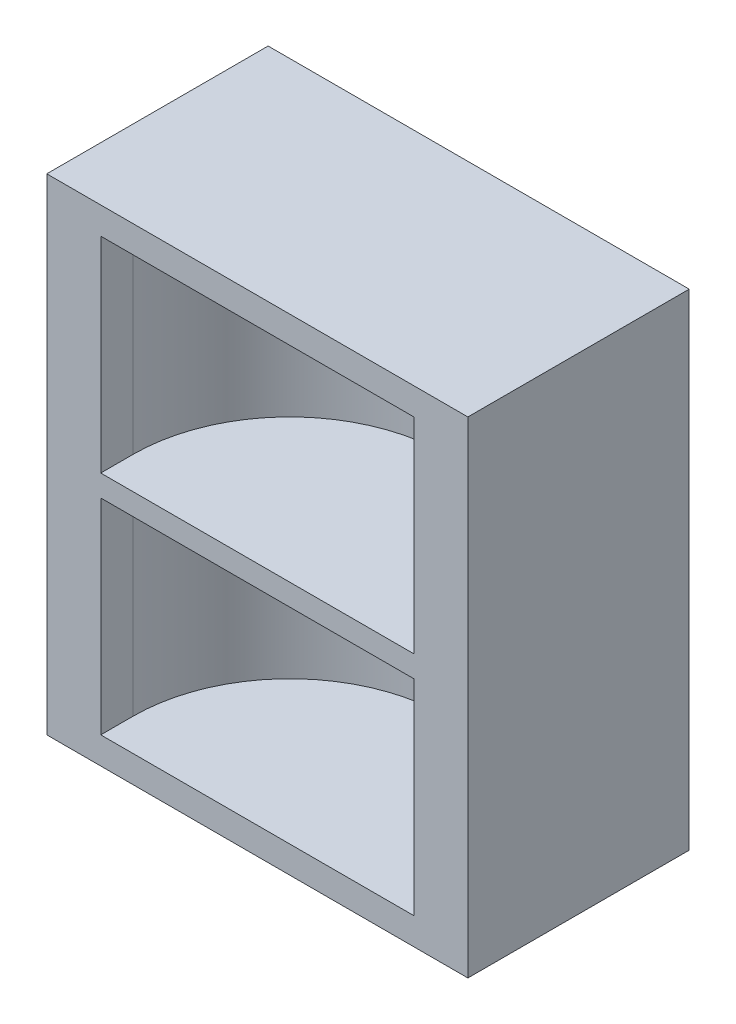
ISO-10303-21;
HEADER;
FILE_DESCRIPTION(('STEP AP214'),'2;1');
FILE_NAME('part.step','',(''),(''),'','','');
FILE_SCHEMA(('AUTOMOTIVE_DESIGN { 1 0 10303 214 1 1 1 1 }'));
ENDSEC;
DATA;
#1=APPLICATION_CONTEXT('core data for automotive mechanical design processes');
#2=APPLICATION_PROTOCOL_DEFINITION('international standard','automotive_design',2000,#1);
#3=PRODUCT_CONTEXT('',#1,'mechanical');
#4=PRODUCT('Part','Part','',(#3));
#5=PRODUCT_RELATED_PRODUCT_CATEGORY('part','',(#4));
#6=PRODUCT_DEFINITION_FORMATION('','',#4);
#7=PRODUCT_DEFINITION_CONTEXT('part definition',#1,'design');
#8=PRODUCT_DEFINITION('design','',#6,#7);
#9=PRODUCT_DEFINITION_SHAPE('','',#8);
#10=(LENGTH_UNIT() NAMED_UNIT(*) SI_UNIT(.MILLI.,.METRE.));
#11=(NAMED_UNIT(*) PLANE_ANGLE_UNIT() SI_UNIT($,.RADIAN.));
#12=(NAMED_UNIT(*) SI_UNIT($,.STERADIAN.) SOLID_ANGLE_UNIT());
#13=UNCERTAINTY_MEASURE_WITH_UNIT(LENGTH_MEASURE(1.E-05),#10,'distance_accuracy_value','');
#14=(GEOMETRIC_REPRESENTATION_CONTEXT(3) GLOBAL_UNCERTAINTY_ASSIGNED_CONTEXT((#13)) GLOBAL_UNIT_ASSIGNED_CONTEXT((#10,
#11,#12)) REPRESENTATION_CONTEXT('',''));
#15=CARTESIAN_POINT('',(0.,0.,0.));
#16=DIRECTION('',(0.,0.,1.));
#17=DIRECTION('',(1.,0.,0.));
#18=AXIS2_PLACEMENT_3D('',#15,#16,#17);
#19=CARTESIAN_POINT('',(39.,45.,0.));
#20=DIRECTION('',(-1.,0.,0.));
#21=DIRECTION('',(0.,0.,1.));
#22=AXIS2_PLACEMENT_3D('',#19,#20,#21);
#23=PLANE('',#22);
#24=DIRECTION('',(0.,0.,-1.));
#25=VECTOR('',#24,1.);
#26=CARTESIAN_POINT('',(39.,-45.,0.));
#27=LINE('',#26,#25);
#28=CARTESIAN_POINT('',(39.,-45.,6.));
#29=VERTEX_POINT('',#28);
#30=CARTESIAN_POINT('',(39.0000000000001,-45.,-35.));
#31=VERTEX_POINT('',#30);
#32=EDGE_CURVE('E66',#29,#31,#27,.T.);
#33=ORIENTED_EDGE('',*,*,#32,.T.);
#34=DIRECTION('',(0.,-1.,0.));
#35=VECTOR('',#34,1.);
#36=CARTESIAN_POINT('',(39.0000000000001,45.,-35.));
#37=LINE('',#36,#35);
#38=CARTESIAN_POINT('',(39.0000000000001,45.,-35.));
#39=VERTEX_POINT('',#38);
#40=EDGE_CURVE('E219',#39,#31,#37,.T.);
#41=ORIENTED_EDGE('',*,*,#40,.F.);
#42=DIRECTION('',(0.,0.,-1.));
#43=VECTOR('',#42,1.);
#44=CARTESIAN_POINT('',(39.,45.,0.));
#45=LINE('',#44,#43);
#46=CARTESIAN_POINT('',(39.,45.,6.));
#47=VERTEX_POINT('',#46);
#48=EDGE_CURVE('E206',#47,#39,#45,.T.);
#49=ORIENTED_EDGE('',*,*,#48,.F.);
#50=DIRECTION('',(0.,1.,0.));
#51=VECTOR('',#50,1.);
#52=CARTESIAN_POINT('',(39.,-45.,6.));
#53=LINE('',#52,#51);
#54=EDGE_CURVE('E192',#29,#47,#53,.T.);
#55=ORIENTED_EDGE('',*,*,#54,.F.);
#56=EDGE_LOOP('',(#33,#41,#49,#55));
#57=FACE_BOUND('',#56,.T.);
#58=ADVANCED_FACE('F39',(#57),#23,.F.);
#59=CARTESIAN_POINT('',(39.0000000000001,45.,-35.));
#60=DIRECTION('',(0.,0.,1.));
#61=DIRECTION('',(1.,0.,0.));
#62=AXIS2_PLACEMENT_3D('',#59,#60,#61);
#63=PLANE('',#62);
#64=DIRECTION('',(-1.,0.,0.));
#65=VECTOR('',#64,1.);
#66=CARTESIAN_POINT('',(39.0000000000001,-45.,-35.));
#67=LINE('',#66,#65);
#68=CARTESIAN_POINT('',(-39.0000000000001,-45.,-35.));
#69=VERTEX_POINT('',#68);
#70=EDGE_CURVE('E214',#31,#69,#67,.T.);
#71=ORIENTED_EDGE('',*,*,#70,.T.);
#72=DIRECTION('',(0.,-1.,0.));
#73=VECTOR('',#72,1.);
#74=CARTESIAN_POINT('',(-39.0000000000001,45.,-35.));
#75=LINE('',#74,#73);
#76=CARTESIAN_POINT('',(-39.0000000000001,45.,-35.));
#77=VERTEX_POINT('',#76);
#78=EDGE_CURVE('E212',#77,#69,#75,.T.);
#79=ORIENTED_EDGE('',*,*,#78,.F.);
#80=DIRECTION('',(-1.,0.,0.));
#81=VECTOR('',#80,1.);
#82=CARTESIAN_POINT('',(39.0000000000001,45.,-35.));
#83=LINE('',#82,#81);
#84=EDGE_CURVE('E55',#39,#77,#83,.T.);
#85=ORIENTED_EDGE('',*,*,#84,.F.);
#86=ORIENTED_EDGE('',*,*,#40,.T.);
#87=EDGE_LOOP('',(#71,#79,#85,#86));
#88=FACE_BOUND('',#87,.T.);
#89=ADVANCED_FACE('F241',(#88),#63,.F.);
#90=CARTESIAN_POINT('',(-39.,45.,0.));
#91=DIRECTION('',(1.,0.,0.));
#92=DIRECTION('',(0.,0.,-1.));
#93=AXIS2_PLACEMENT_3D('',#90,#91,#92);
#94=PLANE('',#93);
#95=DIRECTION('',(0.,0.,1.));
#96=VECTOR('',#95,1.);
#97=CARTESIAN_POINT('',(-39.,-45.,0.));
#98=LINE('',#97,#96);
#99=CARTESIAN_POINT('',(-39.,-45.,6.));
#100=VERTEX_POINT('',#99);
#101=EDGE_CURVE('E208',#69,#100,#98,.T.);
#102=ORIENTED_EDGE('',*,*,#101,.T.);
#103=DIRECTION('',(0.,-1.,0.));
#104=VECTOR('',#103,1.);
#105=CARTESIAN_POINT('',(-39.,45.,6.));
#106=LINE('',#105,#104);
#107=CARTESIAN_POINT('',(-39.,45.,6.));
#108=VERTEX_POINT('',#107);
#109=EDGE_CURVE('E186',#108,#100,#106,.T.);
#110=ORIENTED_EDGE('',*,*,#109,.F.);
#111=DIRECTION('',(0.,0.,1.));
#112=VECTOR('',#111,1.);
#113=CARTESIAN_POINT('',(-39.,45.,0.));
#114=LINE('',#113,#112);
#115=EDGE_CURVE('E210',#77,#108,#114,.T.);
#116=ORIENTED_EDGE('',*,*,#115,.F.);
#117=ORIENTED_EDGE('',*,*,#78,.T.);
#118=EDGE_LOOP('',(#102,#110,#116,#117));
#119=FACE_BOUND('',#118,.T.);
#120=ADVANCED_FACE('F246',(#119),#94,.F.);
#121=CARTESIAN_POINT('',(0.,45.,0.));
#122=DIRECTION('',(0.,-1.,0.));
#123=DIRECTION('',(0.,0.,-1.));
#124=AXIS2_PLACEMENT_3D('',#121,#122,#123);
#125=PLANE('',#124);
#126=ORIENTED_EDGE('',*,*,#115,.T.);
#127=DIRECTION('',(-1.,0.,0.));
#128=VECTOR('',#127,1.);
#129=CARTESIAN_POINT('',(39.,45.,6.));
#130=LINE('',#129,#128);
#131=EDGE_CURVE('E195',#47,#108,#130,.T.);
#132=ORIENTED_EDGE('',*,*,#131,.F.);
#133=ORIENTED_EDGE('',*,*,#48,.T.);
#134=ORIENTED_EDGE('',*,*,#84,.T.);
#135=EDGE_LOOP('',(#126,#132,#133,#134));
#136=FACE_BOUND('',#135,.T.);
#137=ADVANCED_FACE('F250',(#136),#125,.F.);
#138=CARTESIAN_POINT('',(0.,-45.,0.));
#139=DIRECTION('',(0.,-1.,0.));
#140=DIRECTION('',(0.,0.,-1.));
#141=AXIS2_PLACEMENT_3D('',#138,#139,#140);
#142=PLANE('',#141);
#143=ORIENTED_EDGE('',*,*,#32,.F.);
#144=DIRECTION('',(1.,0.,0.));
#145=VECTOR('',#144,1.);
#146=CARTESIAN_POINT('',(-39.,-45.,6.));
#147=LINE('',#146,#145);
#148=EDGE_CURVE('E189',#100,#29,#147,.T.);
#149=ORIENTED_EDGE('',*,*,#148,.F.);
#150=ORIENTED_EDGE('',*,*,#101,.F.);
#151=ORIENTED_EDGE('',*,*,#70,.F.);
#152=EDGE_LOOP('',(#143,#149,#150,#151));
#153=FACE_BOUND('',#152,.T.);
#154=ADVANCED_FACE('F254',(#153),#142,.T.);
#155=CARTESIAN_POINT('',(0.,0.,6.));
#156=DIRECTION('',(0.,0.,1.));
#157=DIRECTION('',(1.,0.,0.));
#158=AXIS2_PLACEMENT_3D('',#155,#156,#157);
#159=PLANE('',#158);
#160=ORIENTED_EDGE('',*,*,#109,.T.);
#161=ORIENTED_EDGE('',*,*,#148,.T.);
#162=ORIENTED_EDGE('',*,*,#54,.T.);
#163=ORIENTED_EDGE('',*,*,#131,.T.);
#164=EDGE_LOOP('',(#160,#161,#162,#163));
#165=FACE_BOUND('',#164,.T.);
#166=DIRECTION('',(0.,1.,0.));
#167=VECTOR('',#166,1.);
#168=CARTESIAN_POINT('',(29.,-1.99999999999997,6.));
#169=LINE('',#168,#167);
#170=CARTESIAN_POINT('',(29.,-40.,6.));
#171=VERTEX_POINT('',#170);
#172=CARTESIAN_POINT('',(29.,-1.99999999999997,6.));
#173=VERTEX_POINT('',#172);
#174=EDGE_CURVE('E167',#171,#173,#169,.T.);
#175=ORIENTED_EDGE('',*,*,#174,.F.);
#176=DIRECTION('',(1.,0.,0.));
#177=VECTOR('',#176,1.);
#178=CARTESIAN_POINT('',(29.,-40.,6.));
#179=LINE('',#178,#177);
#180=CARTESIAN_POINT('',(-29.,-40.,6.));
#181=VERTEX_POINT('',#180);
#182=EDGE_CURVE('E149',#181,#171,#179,.T.);
#183=ORIENTED_EDGE('',*,*,#182,.F.);
#184=DIRECTION('',(0.,-1.,0.));
#185=VECTOR('',#184,1.);
#186=CARTESIAN_POINT('',(-29.,-40.,6.));
#187=LINE('',#186,#185);
#188=CARTESIAN_POINT('',(-29.,-1.99999999999997,6.));
#189=VERTEX_POINT('',#188);
#190=EDGE_CURVE('E172',#189,#181,#187,.T.);
#191=ORIENTED_EDGE('',*,*,#190,.F.);
#192=DIRECTION('',(-1.,0.,0.));
#193=VECTOR('',#192,1.);
#194=CARTESIAN_POINT('',(-29.,-1.99999999999997,6.));
#195=LINE('',#194,#193);
#196=EDGE_CURVE('E169',#173,#189,#195,.T.);
#197=ORIENTED_EDGE('',*,*,#196,.F.);
#198=EDGE_LOOP('',(#175,#183,#191,#197));
#199=FACE_BOUND('',#198,.T.);
#200=DIRECTION('',(-1.,0.,0.));
#201=VECTOR('',#200,1.);
#202=CARTESIAN_POINT('',(-29.,40.,6.));
#203=LINE('',#202,#201);
#204=CARTESIAN_POINT('',(29.,40.,6.));
#205=VERTEX_POINT('',#204);
#206=CARTESIAN_POINT('',(-29.,40.,6.));
#207=VERTEX_POINT('',#206);
#208=EDGE_CURVE('E141',#205,#207,#203,.T.);
#209=ORIENTED_EDGE('',*,*,#208,.F.);
#210=DIRECTION('',(0.,1.,0.));
#211=VECTOR('',#210,1.);
#212=CARTESIAN_POINT('',(29.,40.,6.));
#213=LINE('',#212,#211);
#214=CARTESIAN_POINT('',(29.,1.99999999999999,6.));
#215=VERTEX_POINT('',#214);
#216=EDGE_CURVE('E131',#215,#205,#213,.T.);
#217=ORIENTED_EDGE('',*,*,#216,.F.);
#218=DIRECTION('',(1.,0.,0.));
#219=VECTOR('',#218,1.);
#220=CARTESIAN_POINT('',(29.,1.99999999999999,6.));
#221=LINE('',#220,#219);
#222=CARTESIAN_POINT('',(-29.,1.99999999999999,6.));
#223=VERTEX_POINT('',#222);
#224=EDGE_CURVE('E157',#223,#215,#221,.T.);
#225=ORIENTED_EDGE('',*,*,#224,.F.);
#226=DIRECTION('',(0.,-1.,0.));
#227=VECTOR('',#226,1.);
#228=CARTESIAN_POINT('',(-29.,1.99999999999999,6.));
#229=LINE('',#228,#227);
#230=EDGE_CURVE('E155',#207,#223,#229,.T.);
#231=ORIENTED_EDGE('',*,*,#230,.F.);
#232=EDGE_LOOP('',(#209,#217,#225,#231));
#233=FACE_BOUND('',#232,.T.);
#234=ADVANCED_FACE('F153',(#165,#199,#233),#159,.T.);
#235=CARTESIAN_POINT('',(29.,-1.99999999999997,6.));
#236=DIRECTION('',(-1.,0.,0.));
#237=DIRECTION('',(0.,0.,1.));
#238=AXIS2_PLACEMENT_3D('',#235,#236,#237);
#239=PLANE('',#238);
#240=DIRECTION('',(0.,1.,0.));
#241=VECTOR('',#240,1.);
#242=CARTESIAN_POINT('',(29.,45.,0.));
#243=LINE('',#242,#241);
#244=CARTESIAN_POINT('',(29.,-1.99999999999997,0.));
#245=VERTEX_POINT('',#244);
#246=CARTESIAN_POINT('',(29.,-40.,0.));
#247=VERTEX_POINT('',#246);
#248=EDGE_CURVE('E221',#245,#247,#243,.F.);
#249=ORIENTED_EDGE('',*,*,#248,.T.);
#250=DIRECTION('',(0.,0.,-1.));
#251=VECTOR('',#250,1.);
#252=CARTESIAN_POINT('',(29.,-40.,6.));
#253=LINE('',#252,#251);
#254=EDGE_CURVE('E183',#171,#247,#253,.T.);
#255=ORIENTED_EDGE('',*,*,#254,.F.);
#256=ORIENTED_EDGE('',*,*,#174,.T.);
#257=DIRECTION('',(0.,0.,-1.));
#258=VECTOR('',#257,1.);
#259=CARTESIAN_POINT('',(29.,-1.99999999999997,6.));
#260=LINE('',#259,#258);
#261=EDGE_CURVE('E180',#173,#245,#260,.T.);
#262=ORIENTED_EDGE('',*,*,#261,.T.);
#263=EDGE_LOOP('',(#249,#255,#256,#262));
#264=FACE_BOUND('',#263,.T.);
#265=ADVANCED_FACE('F278',(#264),#239,.T.);
#266=CARTESIAN_POINT('',(-29.,-40.,6.));
#267=DIRECTION('',(1.,0.,0.));
#268=DIRECTION('',(0.,1.,0.));
#269=AXIS2_PLACEMENT_3D('',#266,#267,#268);
#270=PLANE('',#269);
#271=DIRECTION('',(0.,1.,0.));
#272=VECTOR('',#271,1.);
#273=CARTESIAN_POINT('',(-29.,45.,0.));
#274=LINE('',#273,#272);
#275=CARTESIAN_POINT('',(-29.,-40.,0.));
#276=VERTEX_POINT('',#275);
#277=CARTESIAN_POINT('',(-29.,-1.99999999999997,0.));
#278=VERTEX_POINT('',#277);
#279=EDGE_CURVE('E224',#276,#278,#274,.T.);
#280=ORIENTED_EDGE('',*,*,#279,.T.);
#281=DIRECTION('',(0.,0.,-1.));
#282=VECTOR('',#281,1.);
#283=CARTESIAN_POINT('',(-29.,-1.99999999999997,6.));
#284=LINE('',#283,#282);
#285=EDGE_CURVE('E177',#189,#278,#284,.T.);
#286=ORIENTED_EDGE('',*,*,#285,.F.);
#287=ORIENTED_EDGE('',*,*,#190,.T.);
#288=DIRECTION('',(0.,0.,-1.));
#289=VECTOR('',#288,1.);
#290=CARTESIAN_POINT('',(-29.,-40.,6.));
#291=LINE('',#290,#289);
#292=EDGE_CURVE('E174',#181,#276,#291,.T.);
#293=ORIENTED_EDGE('',*,*,#292,.T.);
#294=EDGE_LOOP('',(#280,#286,#287,#293));
#295=FACE_BOUND('',#294,.T.);
#296=ADVANCED_FACE('F238',(#295),#270,.T.);
#297=CARTESIAN_POINT('',(29.,40.,6.));
#298=DIRECTION('',(-1.,0.,0.));
#299=DIRECTION('',(0.,-1.,0.));
#300=AXIS2_PLACEMENT_3D('',#297,#298,#299);
#301=PLANE('',#300);
#302=DIRECTION('',(0.,1.,0.));
#303=VECTOR('',#302,1.);
#304=CARTESIAN_POINT('',(29.,45.,0.));
#305=LINE('',#304,#303);
#306=CARTESIAN_POINT('',(29.,40.,0.));
#307=VERTEX_POINT('',#306);
#308=CARTESIAN_POINT('',(29.,1.99999999999999,0.));
#309=VERTEX_POINT('',#308);
#310=EDGE_CURVE('E47',#307,#309,#305,.F.);
#311=ORIENTED_EDGE('',*,*,#310,.T.);
#312=DIRECTION('',(0.,0.,-1.));
#313=VECTOR('',#312,1.);
#314=CARTESIAN_POINT('',(29.,1.99999999999999,6.));
#315=LINE('',#314,#313);
#316=EDGE_CURVE('E137',#215,#309,#315,.T.);
#317=ORIENTED_EDGE('',*,*,#316,.F.);
#318=ORIENTED_EDGE('',*,*,#216,.T.);
#319=DIRECTION('',(0.,0.,-1.));
#320=VECTOR('',#319,1.);
#321=CARTESIAN_POINT('',(29.,40.,6.));
#322=LINE('',#321,#320);
#323=EDGE_CURVE('E135',#205,#307,#322,.T.);
#324=ORIENTED_EDGE('',*,*,#323,.T.);
#325=EDGE_LOOP('',(#311,#317,#318,#324));
#326=FACE_BOUND('',#325,.T.);
#327=ADVANCED_FACE('F134',(#326),#301,.T.);
#328=CARTESIAN_POINT('',(-29.,1.99999999999999,6.));
#329=DIRECTION('',(1.,0.,0.));
#330=DIRECTION('',(0.,0.,-1.));
#331=AXIS2_PLACEMENT_3D('',#328,#329,#330);
#332=PLANE('',#331);
#333=DIRECTION('',(0.,1.,0.));
#334=VECTOR('',#333,1.);
#335=CARTESIAN_POINT('',(-29.,45.,0.));
#336=LINE('',#335,#334);
#337=CARTESIAN_POINT('',(-29.,1.99999999999999,0.));
#338=VERTEX_POINT('',#337);
#339=CARTESIAN_POINT('',(-29.,40.,0.));
#340=VERTEX_POINT('',#339);
#341=EDGE_CURVE('E11',#338,#340,#336,.T.);
#342=ORIENTED_EDGE('',*,*,#341,.T.);
#343=DIRECTION('',(0.,0.,-1.));
#344=VECTOR('',#343,1.);
#345=CARTESIAN_POINT('',(-29.,40.,6.));
#346=LINE('',#345,#344);
#347=EDGE_CURVE('E150',#207,#340,#346,.T.);
#348=ORIENTED_EDGE('',*,*,#347,.F.);
#349=ORIENTED_EDGE('',*,*,#230,.T.);
#350=DIRECTION('',(0.,0.,-1.));
#351=VECTOR('',#350,1.);
#352=CARTESIAN_POINT('',(-29.,1.99999999999999,6.));
#353=LINE('',#352,#351);
#354=EDGE_CURVE('E162',#223,#338,#353,.T.);
#355=ORIENTED_EDGE('',*,*,#354,.T.);
#356=EDGE_LOOP('',(#342,#348,#349,#355));
#357=FACE_BOUND('',#356,.T.);
#358=ADVANCED_FACE('F229',(#357),#332,.T.);
#359=CARTESIAN_POINT('',(0.,40.,0.));
#360=DIRECTION('',(0.,1.,0.));
#361=DIRECTION('',(0.,0.,1.));
#362=AXIS2_PLACEMENT_3D('',#359,#360,#361);
#363=PLANE('',#362);
#364=CARTESIAN_POINT('',(0.,40.,0.));
#365=DIRECTION('',(0.,1.,0.));
#366=DIRECTION('',(0.,0.,1.));
#367=AXIS2_PLACEMENT_3D('',#364,#365,#366);
#368=CIRCLE('',#367,29.);
#369=EDGE_CURVE('E148',#307,#340,#368,.T.);
#370=ORIENTED_EDGE('',*,*,#369,.F.);
#371=ORIENTED_EDGE('',*,*,#323,.F.);
#372=ORIENTED_EDGE('',*,*,#208,.T.);
#373=ORIENTED_EDGE('',*,*,#347,.T.);
#374=EDGE_LOOP('',(#370,#371,#372,#373));
#375=FACE_BOUND('',#374,.T.);
#376=ADVANCED_FACE('F145',(#375),#363,.F.);
#377=CARTESIAN_POINT('',(0.,45.,0.));
#378=DIRECTION('',(0.,1.,0.));
#379=DIRECTION('',(0.,0.,1.));
#380=AXIS2_PLACEMENT_3D('',#377,#378,#379);
#381=CYLINDRICAL_SURFACE('',#380,29.);
#382=CARTESIAN_POINT('',(0.,1.99999999999999,0.));
#383=DIRECTION('',(0.,1.,0.));
#384=DIRECTION('',(0.,0.,1.));
#385=AXIS2_PLACEMENT_3D('',#382,#383,#384);
#386=CIRCLE('',#385,29.);
#387=EDGE_CURVE('E200',#309,#338,#386,.T.);
#388=ORIENTED_EDGE('',*,*,#387,.F.);
#389=ORIENTED_EDGE('',*,*,#310,.F.);
#390=ORIENTED_EDGE('',*,*,#369,.T.);
#391=ORIENTED_EDGE('',*,*,#341,.F.);
#392=EDGE_LOOP('',(#388,#389,#390,#391));
#393=FACE_BOUND('',#392,.T.);
#394=ADVANCED_FACE('F236',(#393),#381,.F.);
#395=CARTESIAN_POINT('',(0.,2.,0.));
#396=DIRECTION('',(0.,-1.,0.));
#397=DIRECTION('',(0.,0.,-1.));
#398=AXIS2_PLACEMENT_3D('',#395,#396,#397);
#399=PLANE('',#398);
#400=ORIENTED_EDGE('',*,*,#387,.T.);
#401=ORIENTED_EDGE('',*,*,#354,.F.);
#402=ORIENTED_EDGE('',*,*,#224,.T.);
#403=ORIENTED_EDGE('',*,*,#316,.T.);
#404=EDGE_LOOP('',(#400,#401,#402,#403));
#405=FACE_BOUND('',#404,.T.);
#406=ADVANCED_FACE('F227',(#405),#399,.F.);
#407=CARTESIAN_POINT('',(0.,-40.,0.));
#408=DIRECTION('',(0.,-1.,0.));
#409=DIRECTION('',(0.,0.,-1.));
#410=AXIS2_PLACEMENT_3D('',#407,#408,#409);
#411=PLANE('',#410);
#412=CARTESIAN_POINT('',(0.,-40.,0.));
#413=DIRECTION('',(0.,1.,0.));
#414=DIRECTION('',(0.,0.,1.));
#415=AXIS2_PLACEMENT_3D('',#412,#413,#414);
#416=CIRCLE('',#415,29.);
#417=EDGE_CURVE('E198',#247,#276,#416,.T.);
#418=ORIENTED_EDGE('',*,*,#417,.T.);
#419=ORIENTED_EDGE('',*,*,#292,.F.);
#420=ORIENTED_EDGE('',*,*,#182,.T.);
#421=ORIENTED_EDGE('',*,*,#254,.T.);
#422=EDGE_LOOP('',(#418,#419,#420,#421));
#423=FACE_BOUND('',#422,.T.);
#424=ADVANCED_FACE('F267',(#423),#411,.F.);
#425=CARTESIAN_POINT('',(0.,45.,0.));
#426=DIRECTION('',(0.,1.,0.));
#427=DIRECTION('',(0.,0.,1.));
#428=AXIS2_PLACEMENT_3D('',#425,#426,#427);
#429=CYLINDRICAL_SURFACE('',#428,29.);
#430=ORIENTED_EDGE('',*,*,#417,.F.);
#431=ORIENTED_EDGE('',*,*,#248,.F.);
#432=CARTESIAN_POINT('',(0.,-1.99999999999997,0.));
#433=DIRECTION('',(0.,1.,0.));
#434=DIRECTION('',(0.,0.,1.));
#435=AXIS2_PLACEMENT_3D('',#432,#433,#434);
#436=CIRCLE('',#435,29.);
#437=EDGE_CURVE('E201',#245,#278,#436,.T.);
#438=ORIENTED_EDGE('',*,*,#437,.T.);
#439=ORIENTED_EDGE('',*,*,#279,.F.);
#440=EDGE_LOOP('',(#430,#431,#438,#439));
#441=FACE_BOUND('',#440,.T.);
#442=ADVANCED_FACE('F263',(#441),#429,.F.);
#443=CARTESIAN_POINT('',(0.,-1.99999999999997,0.));
#444=DIRECTION('',(0.,1.,0.));
#445=DIRECTION('',(0.,0.,1.));
#446=AXIS2_PLACEMENT_3D('',#443,#444,#445);
#447=PLANE('',#446);
#448=ORIENTED_EDGE('',*,*,#437,.F.);
#449=ORIENTED_EDGE('',*,*,#261,.F.);
#450=ORIENTED_EDGE('',*,*,#196,.T.);
#451=ORIENTED_EDGE('',*,*,#285,.T.);
#452=EDGE_LOOP('',(#448,#449,#450,#451));
#453=FACE_BOUND('',#452,.T.);
#454=ADVANCED_FACE('F260',(#453),#447,.F.);
#455=CLOSED_SHELL('',(#58,#89,#120,#137,#154,#234,#265,#296,#327,#358,#376,#394,#406,#424,#442,#454));
#456=MANIFOLD_SOLID_BREP('B2',#455);
#457=ADVANCED_BREP_SHAPE_REPRESENTATION('',(#18,#456),#14);
#458=SHAPE_DEFINITION_REPRESENTATION(#9,#457);
ENDSEC;
END-ISO-10303-21;
